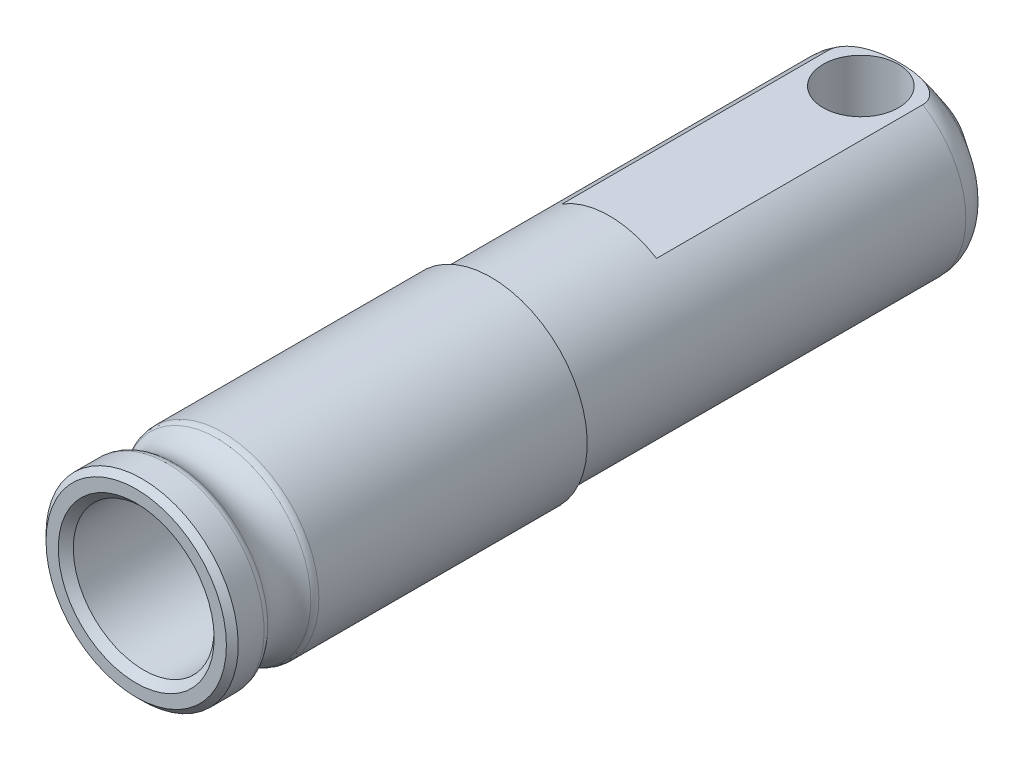
ISO-10303-21;
HEADER;
FILE_DESCRIPTION(('STEP AP214'),'2;1');
FILE_NAME('part.step','',(''),(''),'','','');
FILE_SCHEMA(('AUTOMOTIVE_DESIGN { 1 0 10303 214 1 1 1 1 }'));
ENDSEC;
DATA;
#1=APPLICATION_CONTEXT('core data for automotive mechanical design processes');
#2=APPLICATION_PROTOCOL_DEFINITION('international standard','automotive_design',2000,#1);
#3=PRODUCT_CONTEXT('',#1,'mechanical');
#4=PRODUCT('Part','Part','',(#3));
#5=PRODUCT_RELATED_PRODUCT_CATEGORY('part','',(#4));
#6=PRODUCT_DEFINITION_FORMATION('','',#4);
#7=PRODUCT_DEFINITION_CONTEXT('part definition',#1,'design');
#8=PRODUCT_DEFINITION('design','',#6,#7);
#9=PRODUCT_DEFINITION_SHAPE('','',#8);
#10=(LENGTH_UNIT() NAMED_UNIT(*) SI_UNIT(.MILLI.,.METRE.));
#11=(NAMED_UNIT(*) PLANE_ANGLE_UNIT() SI_UNIT($,.RADIAN.));
#12=(NAMED_UNIT(*) SI_UNIT($,.STERADIAN.) SOLID_ANGLE_UNIT());
#13=UNCERTAINTY_MEASURE_WITH_UNIT(LENGTH_MEASURE(1.E-05),#10,'distance_accuracy_value','');
#14=(GEOMETRIC_REPRESENTATION_CONTEXT(3) GLOBAL_UNCERTAINTY_ASSIGNED_CONTEXT((#13)) GLOBAL_UNIT_ASSIGNED_CONTEXT((#10,
#11,#12)) REPRESENTATION_CONTEXT('',''));
#15=CARTESIAN_POINT('',(0.,0.,0.));
#16=DIRECTION('',(0.,0.,1.));
#17=DIRECTION('',(1.,0.,0.));
#18=AXIS2_PLACEMENT_3D('',#15,#16,#17);
#19=CARTESIAN_POINT('',(0.,0.,7.));
#20=DIRECTION('',(0.,0.,1.));
#21=DIRECTION('',(1.,0.,0.));
#22=AXIS2_PLACEMENT_3D('',#19,#20,#21);
#23=PLANE('',#22);
#24=CARTESIAN_POINT('',(0.,0.,7.));
#25=DIRECTION('',(0.,0.,1.));
#26=DIRECTION('',(1.,0.,0.));
#27=AXIS2_PLACEMENT_3D('',#24,#25,#26);
#28=CIRCLE('',#27,2.63524999999998);
#29=CARTESIAN_POINT('',(2.63524999999998,0.,7.));
#30=VERTEX_POINT('',#29);
#31=EDGE_CURVE('E11',#30,#30,#28,.F.);
#32=ORIENTED_EDGE('',*,*,#31,.T.);
#33=EDGE_LOOP('',(#32));
#34=FACE_BOUND('',#33,.T.);
#35=CARTESIAN_POINT('',(0.,0.,7.000000000005));
#36=DIRECTION('',(0.,0.,-1.));
#37=DIRECTION('',(0.,1.,0.));
#38=AXIS2_PLACEMENT_3D('',#35,#36,#37);
#39=CIRCLE('',#38,3.04999999997335);
#40=CARTESIAN_POINT('',(0.,3.04999999997335,7.000000000005));
#41=VERTEX_POINT('',#40);
#42=EDGE_CURVE('E123',#41,#41,#39,.T.);
#43=ORIENTED_EDGE('',*,*,#42,.F.);
#44=EDGE_LOOP('',(#43));
#45=FACE_BOUND('',#44,.T.);
#46=ADVANCED_FACE('F39',(#34,#45),#23,.T.);
#47=CARTESIAN_POINT('',(0.,0.,6.79999999994152));
#48=DIRECTION('',(0.,0.,-1.));
#49=DIRECTION('',(0.,1.,0.));
#50=AXIS2_PLACEMENT_3D('',#47,#48,#49);
#51=CONICAL_SURFACE('',#50,3.24999999997999,0.78539816325534);
#52=ORIENTED_EDGE('',*,*,#42,.T.);
#53=EDGE_LOOP('',(#52));
#54=FACE_BOUND('',#53,.T.);
#55=CARTESIAN_POINT('',(0.,0.,6.8));
#56=DIRECTION('',(0.,0.,-1.));
#57=DIRECTION('',(-1.,0.,0.));
#58=AXIS2_PLACEMENT_3D('',#55,#56,#57);
#59=CIRCLE('',#58,3.25);
#60=CARTESIAN_POINT('',(-3.25,0.,6.8));
#61=VERTEX_POINT('',#60);
#62=EDGE_CURVE('E128',#61,#61,#59,.T.);
#63=ORIENTED_EDGE('',*,*,#62,.F.);
#64=EDGE_LOOP('',(#63));
#65=FACE_BOUND('',#64,.T.);
#66=ADVANCED_FACE('F445',(#54,#65),#51,.T.);
#67=CARTESIAN_POINT('',(0.,0.,7.));
#68=DIRECTION('',(0.,0.,-1.));
#69=DIRECTION('',(-1.,0.,0.));
#70=AXIS2_PLACEMENT_3D('',#67,#68,#69);
#71=CYLINDRICAL_SURFACE('',#70,3.25);
#72=ORIENTED_EDGE('',*,*,#62,.T.);
#73=EDGE_LOOP('',(#72));
#74=FACE_BOUND('',#73,.T.);
#75=CARTESIAN_POINT('',(-1.7066633817537E-12,0.,5.92601295887262));
#76=DIRECTION('',(0.,0.,-1.));
#77=DIRECTION('',(-1.,0.,0.));
#78=AXIS2_PLACEMENT_3D('',#75,#76,#77);
#79=CIRCLE('',#78,3.25000000000171);
#80=CARTESIAN_POINT('',(-3.25000000000342,0.,5.92601295887263));
#81=VERTEX_POINT('',#80);
#82=EDGE_CURVE('E280',#81,#81,#79,.T.);
#83=ORIENTED_EDGE('',*,*,#82,.F.);
#84=EDGE_LOOP('',(#83));
#85=FACE_BOUND('',#84,.T.);
#86=ADVANCED_FACE('F435',(#74,#85),#71,.T.);
#87=CARTESIAN_POINT('',(-1.7066633817537E-12,0.,5.92601295887262));
#88=DIRECTION('',(0.,0.,-1.));
#89=DIRECTION('',(-1.,0.,0.));
#90=AXIS2_PLACEMENT_3D('',#87,#88,#89);
#91=TOROIDAL_SURFACE('',#90,2.95000000000171,0.3);
#92=ORIENTED_EDGE('',*,*,#82,.T.);
#93=EDGE_LOOP('',(#92));
#94=FACE_BOUND('',#93,.T.);
#95=CARTESIAN_POINT('',(-3.41052809989731E-12,0.,5.72758161054229));
#96=DIRECTION('',(0.,0.,1.));
#97=DIRECTION('',(1.,0.,0.));
#98=AXIS2_PLACEMENT_3D('',#95,#96,#97);
#99=CIRCLE('',#98,3.17500000000299);
#100=CARTESIAN_POINT('',(3.17499999999958,0.,5.72758161054228));
#101=VERTEX_POINT('',#100);
#102=EDGE_CURVE('E271',#101,#101,#99,.T.);
#103=ORIENTED_EDGE('',*,*,#102,.T.);
#104=EDGE_LOOP('',(#103));
#105=FACE_BOUND('',#104,.T.);
#106=ADVANCED_FACE('F256',(#94,#105),#91,.T.);
#107=CARTESIAN_POINT('',(0.,0.,-20.));
#108=DIRECTION('',(0.,0.,-1.));
#109=DIRECTION('',(-1.,0.,0.));
#110=AXIS2_PLACEMENT_3D('',#107,#108,#109);
#111=PLANE('',#110);
#112=CARTESIAN_POINT('',(0.,0.,-20.));
#113=DIRECTION('',(0.,0.,1.));
#114=DIRECTION('',(1.,0.,0.));
#115=AXIS2_PLACEMENT_3D('',#112,#113,#114);
#116=CIRCLE('',#115,0.716666666666765);
#117=CARTESIAN_POINT('',(0.716666666666676,0.,-20.));
#118=VERTEX_POINT('',#117);
#119=CARTESIAN_POINT('',(-0.716666666666853,0.,-20.));
#120=VERTEX_POINT('',#119);
#121=EDGE_CURVE('E238',#118,#120,#116,.T.);
#122=ORIENTED_EDGE('',*,*,#121,.F.);
#123=CARTESIAN_POINT('',(0.,0.,-20.));
#124=DIRECTION('',(0.,0.,1.));
#125=DIRECTION('',(-1.,0.,0.));
#126=AXIS2_PLACEMENT_3D('',#123,#124,#125);
#127=CIRCLE('',#126,0.716666666666765);
#128=EDGE_CURVE('E279',#120,#118,#127,.T.);
#129=ORIENTED_EDGE('',*,*,#128,.F.);
#130=EDGE_LOOP('',(#122,#129));
#131=FACE_BOUND('',#130,.T.);
#132=ADVANCED_FACE('F247',(#131),#111,.T.);
#133=CARTESIAN_POINT('',(-3.41306843898437E-12,0.,5.));
#134=DIRECTION('',(0.,0.,1.));
#135=DIRECTION('',(1.,0.,0.));
#136=AXIS2_PLACEMENT_3D('',#133,#134,#135);
#137=TOROIDAL_SURFACE('',#136,4.00000000000341,1.1);
#138=ORIENTED_EDGE('',*,*,#102,.F.);
#139=EDGE_LOOP('',(#138));
#140=FACE_BOUND('',#139,.T.);
#141=CARTESIAN_POINT('',(-1.70955013071626E-12,0.,4.27241838946452));
#142=DIRECTION('',(0.,0.,1.));
#143=DIRECTION('',(1.,0.,0.));
#144=AXIS2_PLACEMENT_3D('',#141,#142,#143);
#145=CIRCLE('',#144,3.17499999999869);
#146=CARTESIAN_POINT('',(3.17499999999698,0.,4.27241838946452));
#147=VERTEX_POINT('',#146);
#148=EDGE_CURVE('E234',#147,#147,#145,.F.);
#149=ORIENTED_EDGE('',*,*,#148,.F.);
#150=EDGE_LOOP('',(#149));
#151=FACE_BOUND('',#150,.T.);
#152=ADVANCED_FACE('F225',(#140,#151),#137,.F.);
#153=CARTESIAN_POINT('',(-0.716666666666853,0.,-19.));
#154=DIRECTION('',(0.,1.,0.));
#155=DIRECTION('',(-1.,0.,0.));
#156=AXIS2_PLACEMENT_3D('',#153,#154,#155);
#157=CIRCLE('',#156,1.);
#158=TRIMMED_CURVE('',#157,(PARAMETER_VALUE(-2.36980728294869)),
(PARAMETER_VALUE(2.36980728294869)),.T.,.PARAMETER.);
#159=CARTESIAN_POINT('',(0.,0.,-19.));
#160=DIRECTION('',(0.,0.,-1.));
#161=AXIS1_PLACEMENT('',#159,#160);
#162=SURFACE_OF_REVOLUTION('',#158,#161);
#163=ORIENTED_EDGE('',*,*,#128,.T.);
#164=ORIENTED_EDGE('',*,*,#121,.T.);
#165=EDGE_LOOP('',(#163,#164));
#166=FACE_BOUND('',#165,.T.);
#167=CARTESIAN_POINT('',(0.,0.,-19.7999999999752));
#168=DIRECTION('',(0.,0.,1.));
#169=DIRECTION('',(1.,0.,0.));
#170=AXIS2_PLACEMENT_3D('',#167,#168,#169);
#171=CIRCLE('',#170,1.31666666663942);
#172=CARTESIAN_POINT('',(1.31666666663932,0.,-19.7999999999752));
#173=VERTEX_POINT('',#172);
#174=EDGE_CURVE('E212',#173,#173,#171,.T.);
#175=ORIENTED_EDGE('',*,*,#174,.F.);
#176=EDGE_LOOP('',(#175));
#177=FACE_BOUND('',#176,.T.);
#178=ADVANCED_FACE('F220',(#166,#177),#162,.F.);
#179=CARTESIAN_POINT('',(-1.70989654059176E-12,0.,4.07398704113512));
#180=DIRECTION('',(0.,0.,1.));
#181=DIRECTION('',(1.,0.,0.));
#182=AXIS2_PLACEMENT_3D('',#179,#180,#181);
#183=TOROIDAL_SURFACE('',#182,2.9499999999983,0.3);
#184=CARTESIAN_POINT('',(0.,0.,4.07398704113512));
#185=DIRECTION('',(0.,0.,-1.));
#186=DIRECTION('',(-1.,0.,0.));
#187=AXIS2_PLACEMENT_3D('',#184,#185,#186);
#188=CIRCLE('',#187,3.25);
#189=CARTESIAN_POINT('',(-3.25,0.,4.07398704113512));
#190=VERTEX_POINT('',#189);
#191=EDGE_CURVE('E194',#190,#190,#188,.T.);
#192=ORIENTED_EDGE('',*,*,#191,.F.);
#193=EDGE_LOOP('',(#192));
#194=FACE_BOUND('',#193,.T.);
#195=ORIENTED_EDGE('',*,*,#148,.T.);
#196=EDGE_LOOP('',(#195));
#197=FACE_BOUND('',#196,.T.);
#198=ADVANCED_FACE('F215',(#194,#197),#183,.T.);
#199=CARTESIAN_POINT('',(-3.49256214227101E-12,-3.25,-17.5));
#200=DIRECTION('',(0.,1.,0.));
#201=DIRECTION('',(-1.,0.,0.));
#202=AXIS2_PLACEMENT_3D('',#199,#200,#201);
#203=CYLINDRICAL_SURFACE('',#202,1.275);
#204=CARTESIAN_POINT('',(-3.49154732903756E-12,2.6,-17.5));
#205=DIRECTION('',(0.,1.,0.));
#206=DIRECTION('',(-1.,0.,0.));
#207=AXIS2_PLACEMENT_3D('',#204,#205,#206);
#208=CIRCLE('',#207,1.275);
#209=CARTESIAN_POINT('',(-1.27500000000349,2.6,-17.5));
#210=VERTEX_POINT('',#209);
#211=EDGE_CURVE('E204',#210,#210,#208,.T.);
#212=ORIENTED_EDGE('',*,*,#211,.T.);
#213=EDGE_LOOP('',(#212));
#214=FACE_BOUND('',#213,.T.);
#215=CARTESIAN_POINT('',(-3.49244938524507E-12,-2.6,-17.5));
#216=DIRECTION('',(0.,1.,0.));
#217=DIRECTION('',(-1.,0.,0.));
#218=AXIS2_PLACEMENT_3D('',#215,#216,#217);
#219=CIRCLE('',#218,1.275);
#220=CARTESIAN_POINT('',(-1.27500000000349,-2.6,-17.5));
#221=VERTEX_POINT('',#220);
#222=EDGE_CURVE('E193',#221,#221,#219,.F.);
#223=ORIENTED_EDGE('',*,*,#222,.T.);
#224=EDGE_LOOP('',(#223));
#225=FACE_BOUND('',#224,.T.);
#226=ADVANCED_FACE('F219',(#214,#225),#203,.F.);
#227=CARTESIAN_POINT('',(0.,0.,-18.7999999999988));
#228=DIRECTION('',(0.,0.,1.));
#229=DIRECTION('',(1.,0.,0.));
#230=AXIS2_PLACEMENT_3D('',#227,#228,#229);
#231=CONICAL_SURFACE('',#230,2.64999999996017,0.92729521800843);
#232=CARTESIAN_POINT('',(0.,0.,-18.8));
#233=DIRECTION('',(0.,0.,-1.));
#234=DIRECTION('',(-1.,0.,0.));
#235=AXIS2_PLACEMENT_3D('',#232,#233,#234);
#236=CIRCLE('',#235,2.65000000000009);
#237=CARTESIAN_POINT('',(-0.512347538327393,2.6,-18.7999999999958));
#238=VERTEX_POINT('',#237);
#239=CARTESIAN_POINT('',(-0.512347538296274,-2.6,-18.7999999999848));
#240=VERTEX_POINT('',#239);
#241=EDGE_CURVE('E190',#238,#240,#236,.F.);
#242=ORIENTED_EDGE('',*,*,#241,.F.);
#243=CARTESIAN_POINT('',(-0.512347538322927,2.6,-18.7999999999653));
#244=CARTESIAN_POINT('',(-0.427332745589508,2.6,-18.8123767665102));
#245=CARTESIAN_POINT('',(-0.341863986310406,2.6,-18.8217687915117));
#246=CARTESIAN_POINT('',(-0.170928553538625,2.6,-18.834313983532));
#247=CARTESIAN_POINT('',(-0.0854642767766453,2.6,-18.837499999968));
#248=CARTESIAN_POINT('',(0.0854642767473424,2.6,-18.8374999999688));
#249=CARTESIAN_POINT('',(0.170928553509351,2.6,-18.8343139835334));
#250=CARTESIAN_POINT('',(0.341863986281238,2.6,-18.8217687915146));
#251=CARTESIAN_POINT('',(0.427332745560417,2.6,-18.8123767665137));
#252=CARTESIAN_POINT('',(0.512347538293935,2.6,-18.7999999999695));
#253=B_SPLINE_CURVE_WITH_KNOTS('',3,(#243,#244,#245,#246,#247,#248,#249,#250,#251,#252),
.UNSPECIFIED.,.F.,.F.,(4,2,2,2,4),(0.,0.257710646406221,0.514053441173921,0.770396235941626,
1.02810688234785),.UNSPECIFIED.);
#254=CARTESIAN_POINT('',(0.512347538296146,2.6,-18.7999999999848));
#255=VERTEX_POINT('',#254);
#256=EDGE_CURVE('E209',#238,#255,#253,.T.);
#257=ORIENTED_EDGE('',*,*,#256,.T.);
#258=CARTESIAN_POINT('',(0.,0.,-18.8));
#259=DIRECTION('',(0.,0.,-1.));
#260=DIRECTION('',(-1.,0.,0.));
#261=AXIS2_PLACEMENT_3D('',#258,#259,#260);
#262=CIRCLE('',#261,2.65000000000009);
#263=CARTESIAN_POINT('',(0.512347538296098,-2.6,-18.7999999999848));
#264=VERTEX_POINT('',#263);
#265=EDGE_CURVE('E138',#264,#255,#262,.F.);
#266=ORIENTED_EDGE('',*,*,#265,.F.);
#267=CARTESIAN_POINT('',(0.512347538293843,-2.6,-18.7999999999695));
#268=CARTESIAN_POINT('',(0.42733274556276,-2.6,-18.8123767665134));
#269=CARTESIAN_POINT('',(0.341863986286043,-2.6,-18.8217687915141));
#270=CARTESIAN_POINT('',(0.170928553519055,-2.6,-18.8343139835329));
#271=CARTESIAN_POINT('',(0.0854642767594833,-2.6,-18.8374999999684));
#272=CARTESIAN_POINT('',(-0.0854642767596595,-2.6,-18.8374999999684));
#273=CARTESIAN_POINT('',(-0.170928553519231,-2.6,-18.8343139835329));
#274=CARTESIAN_POINT('',(-0.341863986286219,-2.6,-18.8217687915141));
#275=CARTESIAN_POINT('',(-0.427332745562937,-2.6,-18.8123767665134));
#276=CARTESIAN_POINT('',(-0.512347538294019,-2.6,-18.7999999999695));
#277=B_SPLINE_CURVE_WITH_KNOTS('',3,(#267,#268,#269,#270,#271,#272,#273,#274,#275,#276),
.UNSPECIFIED.,.F.,.F.,(4,2,2,2,4),(0.,0.257710646398846,0.514053441159284,0.770396235919723,
1.02810688231857),.UNSPECIFIED.);
#278=EDGE_CURVE('E171',#264,#240,#277,.T.);
#279=ORIENTED_EDGE('',*,*,#278,.T.);
#280=EDGE_LOOP('',(#242,#257,#266,#279));
#281=FACE_BOUND('',#280,.T.);
#282=ORIENTED_EDGE('',*,*,#174,.T.);
#283=EDGE_LOOP('',(#282));
#284=FACE_BOUND('',#283,.T.);
#285=ADVANCED_FACE('F319',(#281,#284),#231,.T.);
#286=CARTESIAN_POINT('',(-16.5,3.25,-9.));
#287=DIRECTION('',(0.,0.,1.));
#288=DIRECTION('',(1.,0.,0.));
#289=AXIS2_PLACEMENT_3D('',#286,#287,#288);
#290=PLANE('',#289);
#291=CARTESIAN_POINT('',(0.,0.,-8.9999999999999));
#292=DIRECTION('',(0.,0.,1.));
#293=DIRECTION('',(1.,0.,0.));
#294=AXIS2_PLACEMENT_3D('',#291,#292,#293);
#295=CIRCLE('',#294,3.05000000000008);
#296=CARTESIAN_POINT('',(1.59452187191028,2.6,-8.9999999999999));
#297=VERTEX_POINT('',#296);
#298=CARTESIAN_POINT('',(-1.5945218719104,2.6,-8.9999999999999));
#299=VERTEX_POINT('',#298);
#300=EDGE_CURVE('E201',#297,#299,#295,.T.);
#301=ORIENTED_EDGE('',*,*,#300,.F.);
#302=DIRECTION('',(1.,0.,0.));
#303=VECTOR('',#302,1.);
#304=CARTESIAN_POINT('',(-16.5,2.6,-8.9999999999999));
#305=LINE('',#304,#303);
#306=EDGE_CURVE('E98',#297,#299,#305,.F.);
#307=ORIENTED_EDGE('',*,*,#306,.T.);
#308=EDGE_LOOP('',(#301,#307));
#309=FACE_BOUND('',#308,.T.);
#310=ADVANCED_FACE('F299',(#309),#290,.F.);
#311=CARTESIAN_POINT('',(-16.5,2.6,-9.));
#312=DIRECTION('',(0.,-1.,0.));
#313=DIRECTION('',(0.,0.,-1.));
#314=AXIS2_PLACEMENT_3D('',#311,#312,#313);
#315=PLANE('',#314);
#316=CARTESIAN_POINT('',(-1.59452187191043,2.6,-18.));
#317=CARTESIAN_POINT('',(-1.59452638455657,2.6,-18.0181365019888));
#318=CARTESIAN_POINT('',(-1.59357716504775,2.6,-18.0362595563638));
#319=CARTESIAN_POINT('',(-1.58982381542157,2.6,-18.072293358425));
#320=CARTESIAN_POINT('',(-1.58702168740023,2.6,-18.0902043140478));
#321=CARTESIAN_POINT('',(-1.57600175233594,2.6,-18.1429680137566));
#322=CARTESIAN_POINT('',(-1.56516746217746,2.6,-18.177301293636));
#323=CARTESIAN_POINT('',(-1.53749789816598,2.6,-18.2432251540065));
#324=CARTESIAN_POINT('',(-1.5206857517359,2.6,-18.27482572918));
#325=CARTESIAN_POINT('',(-1.48218601492308,2.6,-18.3349765692817));
#326=CARTESIAN_POINT('',(-1.46048464149315,2.6,-18.3635178675301));
#327=CARTESIAN_POINT('',(-1.40361380098433,2.6,-18.4283899994032));
#328=CARTESIAN_POINT('',(-1.36658111656009,2.6,-18.4630784351531));
#329=CARTESIAN_POINT('',(-1.28756675336517,2.6,-18.5262062044816));
#330=CARTESIAN_POINT('',(-1.24557578473176,2.6,-18.5546335123855));
#331=CARTESIAN_POINT('',(-1.13035333488108,2.59999999999999,-18.6225000448207));
#332=CARTESIAN_POINT('',(-1.05439718131465,2.6,-18.6572646097585));
#333=CARTESIAN_POINT('',(-0.898290173350697,2.6,-18.715431362123));
#334=CARTESIAN_POINT('',(-0.818128034002298,2.6,-18.7388010472013));
#335=CARTESIAN_POINT('',(-0.699787609320912,2.6,-18.7665764914759));
#336=CARTESIAN_POINT('',(-0.662364066083862,2.6,-18.7744010137588));
#337=CARTESIAN_POINT('',(-0.587442580602268,2.6,-18.7883795353442));
#338=CARTESIAN_POINT('',(-0.54994650681275,2.6,-18.794543499013));
#339=CARTESIAN_POINT('',(-0.512347538327349,2.6,-18.7999999999958));
#340=B_SPLINE_CURVE_WITH_KNOTS('',3,(#316,#317,#318,#319,#320,#321,#322,#323,#324,#325,#326,
#327,#328,#329,#330,#331,#332,#333,#334,#335,#336,#337,#338,#339),.UNSPECIFIED.,.F.,.F.,(4,2,2,
2,2,2,2,2,2,2,2,4),(0.,0.05435950062088,0.108660360737127,0.215938070539348,0.322805175998554,
0.429977402492624,0.581352056766432,0.733014967075772,0.982209476205451,1.23211068022507,
1.34678143385737,1.46074793888463),.UNSPECIFIED.);
#341=CARTESIAN_POINT('',(-1.59452187191043,2.6,-18.));
#342=VERTEX_POINT('',#341);
#343=EDGE_CURVE('E203',#342,#238,#340,.T.);
#344=ORIENTED_EDGE('',*,*,#343,.F.);
#345=DIRECTION('',(0.,0.,1.));
#346=VECTOR('',#345,1.);
#347=CARTESIAN_POINT('',(-1.59452187190685,2.6,1008.));
#348=LINE('',#347,#346);
#349=EDGE_CURVE('E197',#299,#342,#348,.F.);
#350=ORIENTED_EDGE('',*,*,#349,.F.);
#351=ORIENTED_EDGE('',*,*,#306,.F.);
#352=DIRECTION('',(0.,0.,1.));
#353=VECTOR('',#352,1.);
#354=CARTESIAN_POINT('',(1.59452187191383,2.6,1008.));
#355=LINE('',#354,#353);
#356=CARTESIAN_POINT('',(1.59452187191025,2.6,-18.));
#357=VERTEX_POINT('',#356);
#358=EDGE_CURVE('E205',#357,#297,#355,.T.);
#359=ORIENTED_EDGE('',*,*,#358,.F.);
#360=CARTESIAN_POINT('',(0.512347538298357,2.6,-18.8));
#361=CARTESIAN_POINT('',(0.563149448722196,2.6,-18.7926081694088));
#362=CARTESIAN_POINT('',(0.61380461900709,2.6,-18.78394851083));
#363=CARTESIAN_POINT('',(0.714710855837846,2.6,-18.7635167409459));
#364=CARTESIAN_POINT('',(0.764959138755041,2.6,-18.7517310137461));
#365=CARTESIAN_POINT('',(0.865204347269636,2.6,-18.7243296528722));
#366=CARTESIAN_POINT('',(0.915187139718743,2.6,-18.7086611193684));
#367=CARTESIAN_POINT('',(1.01346325078016,2.6,-18.6728861986748));
#368=CARTESIAN_POINT('',(1.06175966057001,2.6,-18.6527884850459));
#369=CARTESIAN_POINT('',(1.15163364416096,2.6,-18.6093338311628));
#370=CARTESIAN_POINT('',(1.19342609106626,2.60000000000001,-18.5864281359831));
#371=CARTESIAN_POINT('',(1.27379912075539,2.59999999999999,-18.5355840304833));
#372=CARTESIAN_POINT('',(1.31238484567648,2.59999999999995,-18.5076539139705));
#373=CARTESIAN_POINT('',(1.38539400495647,2.60000000000001,-18.4456991911289));
#374=CARTESIAN_POINT('',(1.41974816846823,2.60000000000011,-18.4115912830682));
#375=CARTESIAN_POINT('',(1.48124288023945,2.59999999999989,-18.3373612302481));
#376=CARTESIAN_POINT('',(1.50840410367524,2.59999999999958,-18.2972568531334));
#377=CARTESIAN_POINT('',(1.54492035381436,2.59999999999971,-18.2269056458753));
#378=CARTESIAN_POINT('',(1.557177895898,2.59999999999993,-18.198156395604));
#379=CARTESIAN_POINT('',(1.57675457982231,2.60000000000008,-18.1390388655556));
#380=CARTESIAN_POINT('',(1.58408426986133,2.60000000000001,-18.108674195055));
#381=CARTESIAN_POINT('',(1.59063151780417,2.59999999999999,-18.0650362199837));
#382=CARTESIAN_POINT('',(1.59208827642377,2.6,-18.0520705204712));
#383=CARTESIAN_POINT('',(1.59403336572927,2.6,-18.0260720588636));
#384=CARTESIAN_POINT('',(1.59452208969527,2.60000000000001,-18.0130393261603));
#385=CARTESIAN_POINT('',(1.59452187191025,2.6,-18.));
#386=B_SPLINE_CURVE_WITH_KNOTS('',3,(#360,#361,#362,#363,#364,#365,#366,#367,#368,#369,#370,
#371,#372,#373,#374,#375,#376,#377,#378,#379,#380,#381,#382,#383,#384,#385),.UNSPECIFIED.,.F.,
.F.,(4,2,2,2,2,2,2,2,2,2,2,2,4),(0.,0.154050765632774,0.308783858109109,0.465753667288842,
0.622418775181399,0.765095356129828,0.907538546731808,1.05206885101855,1.1961790981966,
1.28957553046733,1.38277140321643,1.42188324686408,1.46097919741619),.UNSPECIFIED.);
#387=EDGE_CURVE('E154',#255,#357,#386,.T.);
#388=ORIENTED_EDGE('',*,*,#387,.F.);
#389=ORIENTED_EDGE('',*,*,#256,.F.);
#390=EDGE_LOOP('',(#344,#350,#351,#359,#388,#389));
#391=FACE_BOUND('',#390,.T.);
#392=ORIENTED_EDGE('',*,*,#211,.F.);
#393=EDGE_LOOP('',(#392));
#394=FACE_BOUND('',#393,.T.);
#395=ADVANCED_FACE('F300',(#391,#394),#315,.F.);
#396=CARTESIAN_POINT('',(0.,0.,7.));
#397=DIRECTION('',(0.,0.,-1.));
#398=DIRECTION('',(-1.,0.,0.));
#399=AXIS2_PLACEMENT_3D('',#396,#397,#398);
#400=CYLINDRICAL_SURFACE('',#399,3.25);
#401=ORIENTED_EDGE('',*,*,#191,.T.);
#402=EDGE_LOOP('',(#401));
#403=FACE_BOUND('',#402,.T.);
#404=CARTESIAN_POINT('',(0.,0.,-4.99999999999998));
#405=DIRECTION('',(0.,0.,-1.));
#406=DIRECTION('',(-1.,0.,0.));
#407=AXIS2_PLACEMENT_3D('',#404,#405,#406);
#408=CIRCLE('',#407,3.25);
#409=CARTESIAN_POINT('',(-3.25,0.,-4.99999999999998));
#410=VERTEX_POINT('',#409);
#411=EDGE_CURVE('E200',#410,#410,#408,.F.);
#412=ORIENTED_EDGE('',*,*,#411,.T.);
#413=EDGE_LOOP('',(#412));
#414=FACE_BOUND('',#413,.T.);
#415=ADVANCED_FACE('F183',(#403,#414),#400,.T.);
#416=CARTESIAN_POINT('',(0.,0.,-18.));
#417=DIRECTION('',(0.,0.,-1.));
#418=DIRECTION('',(-1.,0.,0.));
#419=AXIS2_PLACEMENT_3D('',#416,#417,#418);
#420=TOROIDAL_SURFACE('',#419,2.05000000000008,1.);
#421=ORIENTED_EDGE('',*,*,#241,.T.);
#422=CARTESIAN_POINT('',(-0.512347538298441,-2.6,-18.8));
#423=CARTESIAN_POINT('',(-0.563149448722283,-2.6,-18.7926081694088));
#424=CARTESIAN_POINT('',(-0.613804619007181,-2.6,-18.78394851083));
#425=CARTESIAN_POINT('',(-0.714710855837942,-2.6,-18.7635167409459));
#426=CARTESIAN_POINT('',(-0.764959138755141,-2.6,-18.7517310137461));
#427=CARTESIAN_POINT('',(-0.865204347269743,-2.6,-18.7243296528722));
#428=CARTESIAN_POINT('',(-0.915187139718855,-2.6,-18.7086611193684));
#429=CARTESIAN_POINT('',(-1.01346325078028,-2.6,-18.6728861986748));
#430=CARTESIAN_POINT('',(-1.06175966057013,-2.6,-18.6527884850459));
#431=CARTESIAN_POINT('',(-1.15163364416109,-2.6,-18.6093338311629));
#432=CARTESIAN_POINT('',(-1.1934260910664,-2.60000000000001,-18.5864281359832));
#433=CARTESIAN_POINT('',(-1.27379912075554,-2.59999999999999,-18.5355840304834));
#434=CARTESIAN_POINT('',(-1.31238484567663,-2.59999999999996,-18.5076539139705));
#435=CARTESIAN_POINT('',(-1.38539400495663,-2.60000000000002,-18.445699191129));
#436=CARTESIAN_POINT('',(-1.41974816846839,-2.60000000000011,-18.4115912830682));
#437=CARTESIAN_POINT('',(-1.48124288023962,-2.59999999999989,-18.3373612302481));
#438=CARTESIAN_POINT('',(-1.5084041036754,-2.59999999999958,-18.2972568531334));
#439=CARTESIAN_POINT('',(-1.54492035381453,-2.59999999999971,-18.2269056458753));
#440=CARTESIAN_POINT('',(-1.55717789589817,-2.59999999999993,-18.198156395604));
#441=CARTESIAN_POINT('',(-1.57675457982248,-2.60000000000008,-18.1390388655556));
#442=CARTESIAN_POINT('',(-1.58408426986151,-2.60000000000001,-18.1086741950551));
#443=CARTESIAN_POINT('',(-1.59063151780435,-2.6,-18.0650362199837));
#444=CARTESIAN_POINT('',(-1.59208827642395,-2.6,-18.0520705204712));
#445=CARTESIAN_POINT('',(-1.59403336572945,-2.6,-18.0260720588636));
#446=CARTESIAN_POINT('',(-1.59452208969545,-2.60000000000001,-18.0130393261603));
#447=CARTESIAN_POINT('',(-1.59452187191043,-2.6,-18.));
#448=B_SPLINE_CURVE_WITH_KNOTS('',3,(#422,#423,#424,#425,#426,#427,#428,#429,#430,#431,#432,
#433,#434,#435,#436,#437,#438,#439,#440,#441,#442,#443,#444,#445,#446,#447),.UNSPECIFIED.,.F.,
.F.,(4,2,2,2,2,2,2,2,2,2,2,2,4),(0.,0.154050765632784,0.308783858109126,0.46575366728887,
0.622418775181438,0.765095356129877,0.907538546731865,1.05206885101862,1.19617909819667,
1.2895755304674,1.38277140321651,1.42188324686416,1.46097919741628),.UNSPECIFIED.);
#449=CARTESIAN_POINT('',(-1.59452187191043,-2.6,-18.));
#450=VERTEX_POINT('',#449);
#451=EDGE_CURVE('E165',#240,#450,#448,.T.);
#452=ORIENTED_EDGE('',*,*,#451,.T.);
#453=CARTESIAN_POINT('',(0.,0.,-18.));
#454=DIRECTION('',(0.,0.,1.));
#455=DIRECTION('',(1.,0.,0.));
#456=AXIS2_PLACEMENT_3D('',#453,#454,#455);
#457=CIRCLE('',#456,3.05000000000008);
#458=EDGE_CURVE('E83',#342,#450,#457,.T.);
#459=ORIENTED_EDGE('',*,*,#458,.F.);
#460=ORIENTED_EDGE('',*,*,#343,.T.);
#461=EDGE_LOOP('',(#421,#452,#459,#460));
#462=FACE_BOUND('',#461,.T.);
#463=ADVANCED_FACE('F177',(#462),#420,.T.);
#464=CARTESIAN_POINT('',(-16.5,-3.25,-9.));
#465=DIRECTION('',(0.,0.,1.));
#466=DIRECTION('',(1.,0.,0.));
#467=AXIS2_PLACEMENT_3D('',#464,#465,#466);
#468=PLANE('',#467);
#469=CARTESIAN_POINT('',(0.,0.,-8.9999999999999));
#470=DIRECTION('',(0.,0.,1.));
#471=DIRECTION('',(1.,0.,0.));
#472=AXIS2_PLACEMENT_3D('',#469,#470,#471);
#473=CIRCLE('',#472,3.05000000000008);
#474=CARTESIAN_POINT('',(-1.5945218719104,-2.6,-8.9999999999999));
#475=VERTEX_POINT('',#474);
#476=CARTESIAN_POINT('',(1.59452187191028,-2.6,-8.9999999999999));
#477=VERTEX_POINT('',#476);
#478=EDGE_CURVE('E291',#475,#477,#473,.T.);
#479=ORIENTED_EDGE('',*,*,#478,.F.);
#480=DIRECTION('',(1.,0.,0.));
#481=VECTOR('',#480,1.);
#482=CARTESIAN_POINT('',(-16.5,-2.6,-8.9999999999999));
#483=LINE('',#482,#481);
#484=EDGE_CURVE('E364',#475,#477,#483,.T.);
#485=ORIENTED_EDGE('',*,*,#484,.T.);
#486=EDGE_LOOP('',(#479,#485));
#487=FACE_BOUND('',#486,.T.);
#488=ADVANCED_FACE('F182',(#487),#468,.F.);
#489=CARTESIAN_POINT('',(-16.5,-2.6,-9.));
#490=DIRECTION('',(0.,1.,0.));
#491=DIRECTION('',(0.,0.,1.));
#492=AXIS2_PLACEMENT_3D('',#489,#490,#491);
#493=PLANE('',#492);
#494=ORIENTED_EDGE('',*,*,#451,.F.);
#495=ORIENTED_EDGE('',*,*,#278,.F.);
#496=CARTESIAN_POINT('',(1.59452187191025,-2.6,-18.));
#497=CARTESIAN_POINT('',(1.59452638455639,-2.6,-18.0181365019888));
#498=CARTESIAN_POINT('',(1.59357716504757,-2.6,-18.0362595563638));
#499=CARTESIAN_POINT('',(1.58982381542139,-2.6,-18.072293358425));
#500=CARTESIAN_POINT('',(1.58702168740005,-2.6,-18.0902043140478));
#501=CARTESIAN_POINT('',(1.57600175233577,-2.6,-18.1429680137566));
#502=CARTESIAN_POINT('',(1.56516746217728,-2.6,-18.177301293636));
#503=CARTESIAN_POINT('',(1.53749789816581,-2.6,-18.2432251540065));
#504=CARTESIAN_POINT('',(1.52068575173573,-2.6,-18.27482572918));
#505=CARTESIAN_POINT('',(1.4821860149229,-2.6,-18.3349765692817));
#506=CARTESIAN_POINT('',(1.46048464149297,-2.6,-18.3635178675301));
#507=CARTESIAN_POINT('',(1.40361380098416,-2.6,-18.4283899994032));
#508=CARTESIAN_POINT('',(1.36658111655991,-2.6,-18.4630784351531));
#509=CARTESIAN_POINT('',(1.287566753365,-2.6,-18.5262062044816));
#510=CARTESIAN_POINT('',(1.24557578473158,-2.6,-18.5546335123855));
#511=CARTESIAN_POINT('',(1.13035333488092,-2.59999999999999,-18.6225000448207));
#512=CARTESIAN_POINT('',(1.0543971813145,-2.6,-18.6572646097585));
#513=CARTESIAN_POINT('',(0.898290173350556,-2.6,-18.715431362123));
#514=CARTESIAN_POINT('',(0.818128034002148,-2.6,-18.7388010472013));
#515=CARTESIAN_POINT('',(0.699787609315979,-2.6,-18.766576491477));
#516=CARTESIAN_POINT('',(0.662364066074105,-2.6,-18.7744010137608));
#517=CARTESIAN_POINT('',(0.587442580582856,-2.6,-18.7883795353476));
#518=CARTESIAN_POINT('',(0.549946506788509,-2.6,-18.7945434990169));
#519=CARTESIAN_POINT('',(0.512347538298265,-2.6,-18.8));
#520=B_SPLINE_CURVE_WITH_KNOTS('',3,(#496,#497,#498,#499,#500,#501,#502,#503,#504,#505,#506,
#507,#508,#509,#510,#511,#512,#513,#514,#515,#516,#517,#518,#519),.UNSPECIFIED.,.F.,.F.,(4,2,2,
2,2,2,2,2,2,2,2,4),(0.,0.05435950062088,0.108660360737127,0.215938070539344,0.322805175998545,
0.42997740249262,0.581352056766429,0.733014967075763,0.982209476205399,1.23211068022505,
1.34678143387205,1.46074793891383),.UNSPECIFIED.);
#521=CARTESIAN_POINT('',(1.59452187191024,-2.6,-18.));
#522=VERTEX_POINT('',#521);
#523=EDGE_CURVE('E57',#522,#264,#520,.T.);
#524=ORIENTED_EDGE('',*,*,#523,.F.);
#525=DIRECTION('',(0.,0.,1.));
#526=VECTOR('',#525,1.);
#527=CARTESIAN_POINT('',(1.59452187191382,-2.60000000000001,1008.));
#528=LINE('',#527,#526);
#529=EDGE_CURVE('E133',#477,#522,#528,.F.);
#530=ORIENTED_EDGE('',*,*,#529,.F.);
#531=ORIENTED_EDGE('',*,*,#484,.F.);
#532=DIRECTION('',(0.,0.,1.));
#533=VECTOR('',#532,1.);
#534=CARTESIAN_POINT('',(-1.59452187190685,-2.6,1008.));
#535=LINE('',#534,#533);
#536=EDGE_CURVE('E294',#450,#475,#535,.T.);
#537=ORIENTED_EDGE('',*,*,#536,.F.);
#538=EDGE_LOOP('',(#494,#495,#524,#530,#531,#537));
#539=FACE_BOUND('',#538,.T.);
#540=ORIENTED_EDGE('',*,*,#222,.F.);
#541=EDGE_LOOP('',(#540));
#542=FACE_BOUND('',#541,.T.);
#543=ADVANCED_FACE('F147',(#539,#542),#493,.F.);
#544=CARTESIAN_POINT('',(0.,0.,-18.));
#545=DIRECTION('',(0.,0.,-1.));
#546=DIRECTION('',(-1.,0.,0.));
#547=AXIS2_PLACEMENT_3D('',#544,#545,#546);
#548=TOROIDAL_SURFACE('',#547,2.05000000000008,1.);
#549=ORIENTED_EDGE('',*,*,#387,.T.);
#550=CARTESIAN_POINT('',(0.,0.,-18.));
#551=DIRECTION('',(0.,0.,1.));
#552=DIRECTION('',(1.,0.,0.));
#553=AXIS2_PLACEMENT_3D('',#550,#551,#552);
#554=CIRCLE('',#553,3.05000000000008);
#555=EDGE_CURVE('E90',#522,#357,#554,.T.);
#556=ORIENTED_EDGE('',*,*,#555,.F.);
#557=ORIENTED_EDGE('',*,*,#523,.T.);
#558=ORIENTED_EDGE('',*,*,#265,.T.);
#559=EDGE_LOOP('',(#549,#556,#557,#558));
#560=FACE_BOUND('',#559,.T.);
#561=ADVANCED_FACE('F141',(#560),#548,.T.);
#562=CARTESIAN_POINT('',(3.78108887084417,0.,-5.));
#563=DIRECTION('',(0.,0.,1.));
#564=DIRECTION('',(1.,0.,0.));
#565=AXIS2_PLACEMENT_3D('',#562,#563,#564);
#566=PLANE('',#565);
#567=ORIENTED_EDGE('',*,*,#411,.F.);
#568=EDGE_LOOP('',(#567));
#569=FACE_BOUND('',#568,.T.);
#570=CARTESIAN_POINT('',(0.,0.,-4.99999999999989));
#571=DIRECTION('',(0.,0.,1.));
#572=DIRECTION('',(1.,0.,0.));
#573=AXIS2_PLACEMENT_3D('',#570,#571,#572);
#574=CIRCLE('',#573,3.05000000000008);
#575=CARTESIAN_POINT('',(3.05000000000003,0.,-4.9999999999999));
#576=VERTEX_POINT('',#575);
#577=EDGE_CURVE('E132',#576,#576,#574,.F.);
#578=ORIENTED_EDGE('',*,*,#577,.F.);
#579=EDGE_LOOP('',(#578));
#580=FACE_BOUND('',#579,.T.);
#581=ADVANCED_FACE('F146',(#569,#580),#566,.F.);
#582=CARTESIAN_POINT('',(3.49148336110938E-12,0.,1008.));
#583=DIRECTION('',(0.,0.,1.));
#584=DIRECTION('',(1.,0.,0.));
#585=AXIS2_PLACEMENT_3D('',#582,#583,#584);
#586=CYLINDRICAL_SURFACE('',#585,3.05000000000008);
#587=ORIENTED_EDGE('',*,*,#349,.T.);
#588=ORIENTED_EDGE('',*,*,#458,.T.);
#589=ORIENTED_EDGE('',*,*,#536,.T.);
#590=ORIENTED_EDGE('',*,*,#478,.T.);
#591=ORIENTED_EDGE('',*,*,#529,.T.);
#592=ORIENTED_EDGE('',*,*,#555,.T.);
#593=ORIENTED_EDGE('',*,*,#358,.T.);
#594=ORIENTED_EDGE('',*,*,#300,.T.);
#595=EDGE_LOOP('',(#587,#588,#589,#590,#591,#592,#593,#594));
#596=FACE_BOUND('',#595,.T.);
#597=ORIENTED_EDGE('',*,*,#577,.T.);
#598=EDGE_LOOP('',(#597));
#599=FACE_BOUND('',#598,.T.);
#600=ADVANCED_FACE('F116',(#596,#599),#586,.T.);
#601=CARTESIAN_POINT('',(0.,0.,-2.525));
#602=DIRECTION('',(0.,0.,1.));
#603=DIRECTION('',(1.,0.,0.));
#604=AXIS2_PLACEMENT_3D('',#601,#602,#603);
#605=CONICAL_SURFACE('',#604,2.38125,1.02974425867665);
#606=CARTESIAN_POINT('',(0.,0.,-3.95579934905938));
#607=VERTEX_POINT('',#606);
#608=VERTEX_LOOP('',#607);
#609=FACE_BOUND('',#608,.T.);
#610=CARTESIAN_POINT('',(0.,0.,-2.525));
#611=DIRECTION('',(0.,0.,1.));
#612=DIRECTION('',(1.,0.,0.));
#613=AXIS2_PLACEMENT_3D('',#610,#611,#612);
#614=CIRCLE('',#613,2.38125);
#615=CARTESIAN_POINT('',(2.38125,0.,-2.525));
#616=VERTEX_POINT('',#615);
#617=EDGE_CURVE('E120',#616,#616,#614,.T.);
#618=ORIENTED_EDGE('',*,*,#617,.T.);
#619=EDGE_LOOP('',(#618));
#620=FACE_BOUND('',#619,.T.);
#621=ADVANCED_FACE('F112',(#609,#620),#605,.F.);
#622=CARTESIAN_POINT('',(0.,0.,7.));
#623=DIRECTION('',(0.,0.,1.));
#624=DIRECTION('',(1.,0.,0.));
#625=AXIS2_PLACEMENT_3D('',#622,#623,#624);
#626=CYLINDRICAL_SURFACE('',#625,2.38124999999999);
#627=CARTESIAN_POINT('',(0.,0.,6.74600000000001));
#628=DIRECTION('',(0.,0.,1.));
#629=DIRECTION('',(1.,0.,0.));
#630=AXIS2_PLACEMENT_3D('',#627,#628,#629);
#631=CIRCLE('',#630,2.38124999999999);
#632=CARTESIAN_POINT('',(2.38124999999999,0.,6.74600000000001));
#633=VERTEX_POINT('',#632);
#634=EDGE_CURVE('E49',#633,#633,#631,.T.);
#635=ORIENTED_EDGE('',*,*,#634,.T.);
#636=EDGE_LOOP('',(#635));
#637=FACE_BOUND('',#636,.T.);
#638=ORIENTED_EDGE('',*,*,#617,.F.);
#639=EDGE_LOOP('',(#638));
#640=FACE_BOUND('',#639,.T.);
#641=ADVANCED_FACE('F115',(#637,#640),#626,.F.);
#642=CARTESIAN_POINT('',(0.,0.,6.74600000000001));
#643=DIRECTION('',(0.,0.,1.));
#644=DIRECTION('',(1.,0.,0.));
#645=AXIS2_PLACEMENT_3D('',#642,#643,#644);
#646=CONICAL_SURFACE('',#645,2.38124999999999,0.785398163397447);
#647=ORIENTED_EDGE('',*,*,#31,.F.);
#648=EDGE_LOOP('',(#647));
#649=FACE_BOUND('',#648,.T.);
#650=ORIENTED_EDGE('',*,*,#634,.F.);
#651=EDGE_LOOP('',(#650));
#652=FACE_BOUND('',#651,.T.);
#653=ADVANCED_FACE('F41',(#649,#652),#646,.F.);
#654=CLOSED_SHELL('',(#46,#66,#86,#106,#132,#152,#178,#198,#226,#285,#310,#395,#415,#463,#488,
#543,#561,#581,#600,#621,#641,#653));
#655=MANIFOLD_SOLID_BREP('B2',#654);
#656=ADVANCED_BREP_SHAPE_REPRESENTATION('',(#18,#655),#14);
#657=SHAPE_DEFINITION_REPRESENTATION(#9,#656);
ENDSEC;
END-ISO-10303-21;
